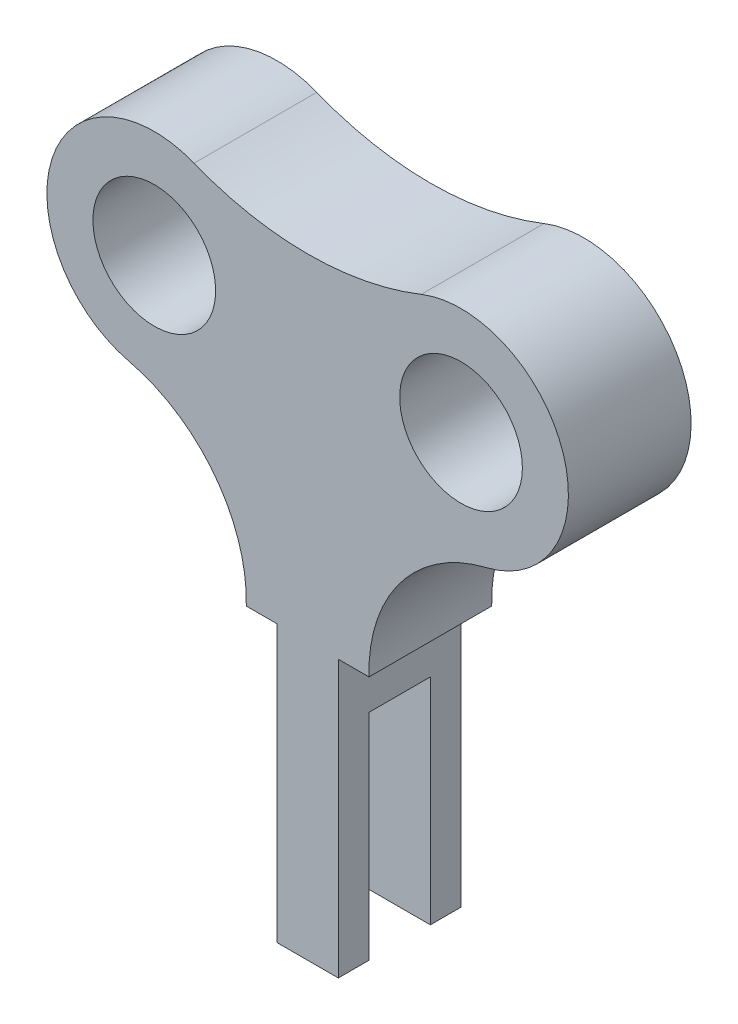
ISO-10303-21;
HEADER;
FILE_DESCRIPTION(('STEP AP214'),'2;1');
FILE_NAME('part.step','',(''),(''),'','','');
FILE_SCHEMA(('AUTOMOTIVE_DESIGN { 1 0 10303 214 1 1 1 1 }'));
ENDSEC;
DATA;
#1=APPLICATION_CONTEXT('core data for automotive mechanical design processes');
#2=APPLICATION_PROTOCOL_DEFINITION('international standard','automotive_design',2000,#1);
#3=PRODUCT_CONTEXT('',#1,'mechanical');
#4=PRODUCT('Part','Part','',(#3));
#5=PRODUCT_RELATED_PRODUCT_CATEGORY('part','',(#4));
#6=PRODUCT_DEFINITION_FORMATION('','',#4);
#7=PRODUCT_DEFINITION_CONTEXT('part definition',#1,'design');
#8=PRODUCT_DEFINITION('design','',#6,#7);
#9=PRODUCT_DEFINITION_SHAPE('','',#8);
#10=(LENGTH_UNIT() NAMED_UNIT(*) SI_UNIT(.MILLI.,.METRE.));
#11=(NAMED_UNIT(*) PLANE_ANGLE_UNIT() SI_UNIT($,.RADIAN.));
#12=(NAMED_UNIT(*) SI_UNIT($,.STERADIAN.) SOLID_ANGLE_UNIT());
#13=UNCERTAINTY_MEASURE_WITH_UNIT(LENGTH_MEASURE(1.E-05),#10,'distance_accuracy_value','');
#14=(GEOMETRIC_REPRESENTATION_CONTEXT(3) GLOBAL_UNCERTAINTY_ASSIGNED_CONTEXT((#13)) GLOBAL_UNIT_ASSIGNED_CONTEXT((#10,
#11,#12)) REPRESENTATION_CONTEXT('',''));
#15=CARTESIAN_POINT('',(0.,0.,0.));
#16=DIRECTION('',(0.,0.,1.));
#17=DIRECTION('',(1.,0.,0.));
#18=AXIS2_PLACEMENT_3D('',#15,#16,#17);
#19=CARTESIAN_POINT('',(-5.,-22.5,10.));
#20=DIRECTION('',(0.,1.,0.));
#21=DIRECTION('',(0.,0.,1.));
#22=AXIS2_PLACEMENT_3D('',#19,#20,#21);
#23=PLANE('',#22);
#24=DIRECTION('',(0.,0.,-1.));
#25=VECTOR('',#24,1.);
#26=CARTESIAN_POINT('',(5.,-22.5,10.));
#27=LINE('',#26,#25);
#28=CARTESIAN_POINT('',(5.,-22.5,-5.));
#29=VERTEX_POINT('',#28);
#30=CARTESIAN_POINT('',(5.,-22.5,-10.));
#31=VERTEX_POINT('',#30);
#32=EDGE_CURVE('E101',#29,#31,#27,.T.);
#33=ORIENTED_EDGE('',*,*,#32,.F.);
#34=DIRECTION('',(-1.,0.,0.));
#35=VECTOR('',#34,1.);
#36=CARTESIAN_POINT('',(41.4005494464026,-22.5,-5.));
#37=LINE('',#36,#35);
#38=CARTESIAN_POINT('',(-5.,-22.5,-5.));
#39=VERTEX_POINT('',#38);
#40=EDGE_CURVE('E246',#29,#39,#37,.T.);
#41=ORIENTED_EDGE('',*,*,#40,.T.);
#42=DIRECTION('',(0.,0.,-1.));
#43=VECTOR('',#42,1.);
#44=CARTESIAN_POINT('',(-5.,-22.5,10.));
#45=LINE('',#44,#43);
#46=CARTESIAN_POINT('',(-5.,-22.5,-10.));
#47=VERTEX_POINT('',#46);
#48=EDGE_CURVE('E187',#39,#47,#45,.T.);
#49=ORIENTED_EDGE('',*,*,#48,.T.);
#50=DIRECTION('',(1.,0.,0.));
#51=VECTOR('',#50,1.);
#52=CARTESIAN_POINT('',(-5.,-22.5,-10.));
#53=LINE('',#52,#51);
#54=EDGE_CURVE('E181',#47,#31,#53,.T.);
#55=ORIENTED_EDGE('',*,*,#54,.T.);
#56=EDGE_LOOP('',(#33,#41,#49,#55));
#57=FACE_BOUND('',#56,.T.);
#58=ADVANCED_FACE('F37',(#57),#23,.F.);
#59=CARTESIAN_POINT('',(-34.990451034251,23.1909103449104,10.));
#60=DIRECTION('',(0.,0.,1.));
#61=DIRECTION('',(1.,0.,0.));
#62=AXIS2_PLACEMENT_3D('',#59,#60,#61);
#63=PLANE('',#62);
#64=CARTESIAN_POINT('',(25.,64.5,10.));
#65=DIRECTION('',(0.,0.,1.));
#66=DIRECTION('',(1.,0.,0.));
#67=AXIS2_PLACEMENT_3D('',#64,#65,#66);
#68=CIRCLE('',#67,10.);
#69=CARTESIAN_POINT('',(35.,64.5,10.));
#70=VERTEX_POINT('',#69);
#71=EDGE_CURVE('E166',#70,#70,#68,.T.);
#72=ORIENTED_EDGE('',*,*,#71,.F.);
#73=EDGE_LOOP('',(#72));
#74=FACE_BOUND('',#73,.T.);
#75=DIRECTION('',(0.,1.,0.));
#76=VECTOR('',#75,1.);
#77=CARTESIAN_POINT('',(5.,22.5,10.));
#78=LINE('',#77,#76);
#79=CARTESIAN_POINT('',(5.,-22.5,10.));
#80=VERTEX_POINT('',#79);
#81=CARTESIAN_POINT('',(5.,22.5,10.));
#82=VERTEX_POINT('',#81);
#83=EDGE_CURVE('E183',#80,#82,#78,.T.);
#84=ORIENTED_EDGE('',*,*,#83,.T.);
#85=DIRECTION('',(1.,0.,0.));
#86=VECTOR('',#85,1.);
#87=CARTESIAN_POINT('',(5.,22.5,10.));
#88=LINE('',#87,#86);
#89=CARTESIAN_POINT('',(10.,22.5,10.));
#90=VERTEX_POINT('',#89);
#91=EDGE_CURVE('E109',#82,#90,#88,.T.);
#92=ORIENTED_EDGE('',*,*,#91,.T.);
#93=CARTESIAN_POINT('',(34.990451034251,23.1909103449104,10.));
#94=DIRECTION('',(0.,0.,-1.));
#95=DIRECTION('',(-1.,0.,0.));
#96=AXIS2_PLACEMENT_3D('',#93,#94,#95);
#97=CIRCLE('',#96,25.);
#98=CARTESIAN_POINT('',(29.1137151317504,47.4903748479043,10.));
#99=VERTEX_POINT('',#98);
#100=EDGE_CURVE('E207',#90,#99,#97,.T.);
#101=ORIENTED_EDGE('',*,*,#100,.T.);
#102=CARTESIAN_POINT('',(25.,64.5,10.));
#103=DIRECTION('',(0.,0.,1.));
#104=DIRECTION('',(-1.,0.,0.));
#105=AXIS2_PLACEMENT_3D('',#102,#103,#104);
#106=CIRCLE('',#105,17.5);
#107=CARTESIAN_POINT('',(18.5185185185185,80.7554728570169,10.));
#108=VERTEX_POINT('',#107);
#109=EDGE_CURVE('E226',#99,#108,#106,.T.);
#110=ORIENTED_EDGE('',*,*,#109,.T.);
#111=CARTESIAN_POINT('',(0.,127.199681019922,10.));
#112=DIRECTION('',(0.,0.,-1.));
#113=DIRECTION('',(1.,0.,0.));
#114=AXIS2_PLACEMENT_3D('',#111,#112,#113);
#115=CIRCLE('',#114,50.);
#116=CARTESIAN_POINT('',(-18.5185185185185,80.7554728570169,10.));
#117=VERTEX_POINT('',#116);
#118=EDGE_CURVE('E223',#108,#117,#115,.T.);
#119=ORIENTED_EDGE('',*,*,#118,.T.);
#120=CARTESIAN_POINT('',(-25.,64.5,10.));
#121=DIRECTION('',(0.,0.,1.));
#122=DIRECTION('',(1.,0.,0.));
#123=AXIS2_PLACEMENT_3D('',#120,#121,#122);
#124=CIRCLE('',#123,17.5);
#125=CARTESIAN_POINT('',(-29.1137151317504,47.4903748479043,10.));
#126=VERTEX_POINT('',#125);
#127=EDGE_CURVE('E225',#117,#126,#124,.T.);
#128=ORIENTED_EDGE('',*,*,#127,.T.);
#129=CARTESIAN_POINT('',(-34.990451034251,23.1909103449104,10.));
#130=DIRECTION('',(0.,0.,-1.));
#131=DIRECTION('',(1.,0.,0.));
#132=AXIS2_PLACEMENT_3D('',#129,#130,#131);
#133=CIRCLE('',#132,25.);
#134=CARTESIAN_POINT('',(-10.,22.5,10.));
#135=VERTEX_POINT('',#134);
#136=EDGE_CURVE('E139',#126,#135,#133,.T.);
#137=ORIENTED_EDGE('',*,*,#136,.T.);
#138=DIRECTION('',(1.,0.,0.));
#139=VECTOR('',#138,1.);
#140=CARTESIAN_POINT('',(-5.,22.5,10.));
#141=LINE('',#140,#139);
#142=CARTESIAN_POINT('',(-5.,22.5,10.));
#143=VERTEX_POINT('',#142);
#144=EDGE_CURVE('E131',#135,#143,#141,.T.);
#145=ORIENTED_EDGE('',*,*,#144,.T.);
#146=DIRECTION('',(0.,-1.,0.));
#147=VECTOR('',#146,1.);
#148=CARTESIAN_POINT('',(-5.,22.5,10.));
#149=LINE('',#148,#147);
#150=CARTESIAN_POINT('',(-5.,-22.5,10.));
#151=VERTEX_POINT('',#150);
#152=EDGE_CURVE('E136',#143,#151,#149,.T.);
#153=ORIENTED_EDGE('',*,*,#152,.T.);
#154=DIRECTION('',(1.,0.,0.));
#155=VECTOR('',#154,1.);
#156=CARTESIAN_POINT('',(-5.,-22.5,10.));
#157=LINE('',#156,#155);
#158=EDGE_CURVE('E61',#151,#80,#157,.T.);
#159=ORIENTED_EDGE('',*,*,#158,.T.);
#160=EDGE_LOOP('',(#84,#92,#101,#110,#119,#128,#137,#145,#153,#159));
#161=FACE_BOUND('',#160,.T.);
#162=CARTESIAN_POINT('',(-25.,64.5,10.));
#163=DIRECTION('',(0.,0.,1.));
#164=DIRECTION('',(-1.,0.,0.));
#165=AXIS2_PLACEMENT_3D('',#162,#163,#164);
#166=CIRCLE('',#165,9.99999999999999);
#167=CARTESIAN_POINT('',(-35.,64.5,10.));
#168=VERTEX_POINT('',#167);
#169=EDGE_CURVE('E237',#168,#168,#166,.T.);
#170=ORIENTED_EDGE('',*,*,#169,.F.);
#171=EDGE_LOOP('',(#170));
#172=FACE_BOUND('',#171,.T.);
#173=ADVANCED_FACE('F133',(#74,#161,#172),#63,.T.);
#174=CARTESIAN_POINT('',(-34.990451034251,23.1909103449104,-10.));
#175=DIRECTION('',(0.,0.,1.));
#176=DIRECTION('',(1.,0.,0.));
#177=AXIS2_PLACEMENT_3D('',#174,#175,#176);
#178=PLANE('',#177);
#179=DIRECTION('',(0.,1.,0.));
#180=VECTOR('',#179,1.);
#181=CARTESIAN_POINT('',(5.,22.5,-10.));
#182=LINE('',#181,#180);
#183=CARTESIAN_POINT('',(5.,22.5,-10.));
#184=VERTEX_POINT('',#183);
#185=EDGE_CURVE('E163',#31,#184,#182,.T.);
#186=ORIENTED_EDGE('',*,*,#185,.F.);
#187=ORIENTED_EDGE('',*,*,#54,.F.);
#188=DIRECTION('',(0.,-1.,0.));
#189=VECTOR('',#188,1.);
#190=CARTESIAN_POINT('',(-5.,22.5,-10.));
#191=LINE('',#190,#189);
#192=CARTESIAN_POINT('',(-5.,22.5,-10.));
#193=VERTEX_POINT('',#192);
#194=EDGE_CURVE('E179',#193,#47,#191,.T.);
#195=ORIENTED_EDGE('',*,*,#194,.F.);
#196=DIRECTION('',(1.,0.,0.));
#197=VECTOR('',#196,1.);
#198=CARTESIAN_POINT('',(-5.,22.5,-10.));
#199=LINE('',#198,#197);
#200=CARTESIAN_POINT('',(-10.,22.5,-10.));
#201=VERTEX_POINT('',#200);
#202=EDGE_CURVE('E148',#201,#193,#199,.T.);
#203=ORIENTED_EDGE('',*,*,#202,.F.);
#204=CARTESIAN_POINT('',(-34.990451034251,23.1909103449104,-10.));
#205=DIRECTION('',(0.,0.,-1.));
#206=DIRECTION('',(1.,0.,0.));
#207=AXIS2_PLACEMENT_3D('',#204,#205,#206);
#208=CIRCLE('',#207,25.);
#209=CARTESIAN_POINT('',(-29.1137151317504,47.4903748479043,-10.));
#210=VERTEX_POINT('',#209);
#211=EDGE_CURVE('E176',#210,#201,#208,.T.);
#212=ORIENTED_EDGE('',*,*,#211,.F.);
#213=CARTESIAN_POINT('',(-25.,64.5,-10.));
#214=DIRECTION('',(0.,0.,1.));
#215=DIRECTION('',(1.,0.,0.));
#216=AXIS2_PLACEMENT_3D('',#213,#214,#215);
#217=CIRCLE('',#216,17.5);
#218=CARTESIAN_POINT('',(-18.5185185185185,80.7554728570169,-10.));
#219=VERTEX_POINT('',#218);
#220=EDGE_CURVE('E174',#219,#210,#217,.T.);
#221=ORIENTED_EDGE('',*,*,#220,.F.);
#222=CARTESIAN_POINT('',(0.,127.199681019922,-10.));
#223=DIRECTION('',(0.,0.,-1.));
#224=DIRECTION('',(1.,0.,0.));
#225=AXIS2_PLACEMENT_3D('',#222,#223,#224);
#226=CIRCLE('',#225,50.);
#227=CARTESIAN_POINT('',(18.5185185185185,80.7554728570169,-10.));
#228=VERTEX_POINT('',#227);
#229=EDGE_CURVE('E172',#228,#219,#226,.T.);
#230=ORIENTED_EDGE('',*,*,#229,.F.);
#231=CARTESIAN_POINT('',(25.,64.5,-10.));
#232=DIRECTION('',(0.,0.,1.));
#233=DIRECTION('',(-1.,0.,0.));
#234=AXIS2_PLACEMENT_3D('',#231,#232,#233);
#235=CIRCLE('',#234,17.5);
#236=CARTESIAN_POINT('',(29.1137151317504,47.4903748479043,-10.));
#237=VERTEX_POINT('',#236);
#238=EDGE_CURVE('E170',#237,#228,#235,.T.);
#239=ORIENTED_EDGE('',*,*,#238,.F.);
#240=CARTESIAN_POINT('',(34.990451034251,23.1909103449104,-10.));
#241=DIRECTION('',(0.,0.,-1.));
#242=DIRECTION('',(-1.,0.,0.));
#243=AXIS2_PLACEMENT_3D('',#240,#241,#242);
#244=CIRCLE('',#243,25.);
#245=CARTESIAN_POINT('',(10.,22.5,-10.));
#246=VERTEX_POINT('',#245);
#247=EDGE_CURVE('E168',#246,#237,#244,.T.);
#248=ORIENTED_EDGE('',*,*,#247,.F.);
#249=DIRECTION('',(1.,0.,0.));
#250=VECTOR('',#249,1.);
#251=CARTESIAN_POINT('',(5.,22.5,-10.));
#252=LINE('',#251,#250);
#253=EDGE_CURVE('E165',#184,#246,#252,.T.);
#254=ORIENTED_EDGE('',*,*,#253,.F.);
#255=EDGE_LOOP('',(#186,#187,#195,#203,#212,#221,#230,#239,#248,#254));
#256=FACE_BOUND('',#255,.T.);
#257=CARTESIAN_POINT('',(25.,64.5,-10.));
#258=DIRECTION('',(0.,0.,1.));
#259=DIRECTION('',(1.,0.,0.));
#260=AXIS2_PLACEMENT_3D('',#257,#258,#259);
#261=CIRCLE('',#260,10.);
#262=CARTESIAN_POINT('',(35.,64.5,-10.));
#263=VERTEX_POINT('',#262);
#264=EDGE_CURVE('E234',#263,#263,#261,.T.);
#265=ORIENTED_EDGE('',*,*,#264,.T.);
#266=EDGE_LOOP('',(#265));
#267=FACE_BOUND('',#266,.T.);
#268=CARTESIAN_POINT('',(-25.,64.5,-10.));
#269=DIRECTION('',(0.,0.,1.));
#270=DIRECTION('',(-1.,0.,0.));
#271=AXIS2_PLACEMENT_3D('',#268,#269,#270);
#272=CIRCLE('',#271,9.99999999999999);
#273=CARTESIAN_POINT('',(-35.,64.5,-10.));
#274=VERTEX_POINT('',#273);
#275=EDGE_CURVE('E240',#274,#274,#272,.T.);
#276=ORIENTED_EDGE('',*,*,#275,.T.);
#277=EDGE_LOOP('',(#276));
#278=FACE_BOUND('',#277,.T.);
#279=ADVANCED_FACE('F211',(#256,#267,#278),#178,.F.);
#280=CARTESIAN_POINT('',(5.,22.5,10.));
#281=DIRECTION('',(-1.,0.,0.));
#282=DIRECTION('',(0.,-1.,0.));
#283=AXIS2_PLACEMENT_3D('',#280,#281,#282);
#284=PLANE('',#283);
#285=DIRECTION('',(0.,0.,1.));
#286=VECTOR('',#285,1.);
#287=CARTESIAN_POINT('',(5.,12.5,-5.));
#288=LINE('',#287,#286);
#289=CARTESIAN_POINT('',(5.,12.5,-5.));
#290=VERTEX_POINT('',#289);
#291=CARTESIAN_POINT('',(5.,12.5,5.));
#292=VERTEX_POINT('',#291);
#293=EDGE_CURVE('E268',#290,#292,#288,.T.);
#294=ORIENTED_EDGE('',*,*,#293,.F.);
#295=DIRECTION('',(0.,1.,0.));
#296=VECTOR('',#295,1.);
#297=CARTESIAN_POINT('',(5.,-22.5,-5.));
#298=LINE('',#297,#296);
#299=EDGE_CURVE('E243',#29,#290,#298,.T.);
#300=ORIENTED_EDGE('',*,*,#299,.F.);
#301=ORIENTED_EDGE('',*,*,#32,.T.);
#302=ORIENTED_EDGE('',*,*,#185,.T.);
#303=DIRECTION('',(0.,0.,-1.));
#304=VECTOR('',#303,1.);
#305=CARTESIAN_POINT('',(5.,22.5,10.));
#306=LINE('',#305,#304);
#307=EDGE_CURVE('E11',#82,#184,#306,.T.);
#308=ORIENTED_EDGE('',*,*,#307,.F.);
#309=ORIENTED_EDGE('',*,*,#83,.F.);
#310=CARTESIAN_POINT('',(5.,-22.5,5.));
#311=VERTEX_POINT('',#310);
#312=EDGE_CURVE('E184',#80,#311,#27,.T.);
#313=ORIENTED_EDGE('',*,*,#312,.T.);
#314=DIRECTION('',(0.,-1.,0.));
#315=VECTOR('',#314,1.);
#316=CARTESIAN_POINT('',(5.,-22.5,5.));
#317=LINE('',#316,#315);
#318=EDGE_CURVE('E52',#292,#311,#317,.T.);
#319=ORIENTED_EDGE('',*,*,#318,.F.);
#320=EDGE_LOOP('',(#294,#300,#301,#302,#308,#309,#313,#319));
#321=FACE_BOUND('',#320,.T.);
#322=ADVANCED_FACE('F39',(#321),#284,.F.);
#323=CARTESIAN_POINT('',(5.,22.5,10.));
#324=DIRECTION('',(0.,1.,0.));
#325=DIRECTION('',(0.,0.,1.));
#326=AXIS2_PLACEMENT_3D('',#323,#324,#325);
#327=PLANE('',#326);
#328=ORIENTED_EDGE('',*,*,#253,.T.);
#329=DIRECTION('',(0.,0.,-1.));
#330=VECTOR('',#329,1.);
#331=CARTESIAN_POINT('',(10.,22.5,10.));
#332=LINE('',#331,#330);
#333=EDGE_CURVE('E45',#90,#246,#332,.T.);
#334=ORIENTED_EDGE('',*,*,#333,.F.);
#335=ORIENTED_EDGE('',*,*,#91,.F.);
#336=ORIENTED_EDGE('',*,*,#307,.T.);
#337=EDGE_LOOP('',(#328,#334,#335,#336));
#338=FACE_BOUND('',#337,.T.);
#339=ADVANCED_FACE('F297',(#338),#327,.F.);
#340=CARTESIAN_POINT('',(34.990451034251,23.1909103449104,10.));
#341=DIRECTION('',(0.,0.,-1.));
#342=DIRECTION('',(-1.,0.,0.));
#343=AXIS2_PLACEMENT_3D('',#340,#341,#342);
#344=CYLINDRICAL_SURFACE('',#343,25.);
#345=ORIENTED_EDGE('',*,*,#247,.T.);
#346=DIRECTION('',(0.,0.,-1.));
#347=VECTOR('',#346,1.);
#348=CARTESIAN_POINT('',(29.1137151317504,47.4903748479043,10.));
#349=LINE('',#348,#347);
#350=EDGE_CURVE('E199',#99,#237,#349,.T.);
#351=ORIENTED_EDGE('',*,*,#350,.F.);
#352=ORIENTED_EDGE('',*,*,#100,.F.);
#353=ORIENTED_EDGE('',*,*,#333,.T.);
#354=EDGE_LOOP('',(#345,#351,#352,#353));
#355=FACE_BOUND('',#354,.T.);
#356=ADVANCED_FACE('F205',(#355),#344,.F.);
#357=CARTESIAN_POINT('',(25.,64.5,10.));
#358=DIRECTION('',(0.,0.,-1.));
#359=DIRECTION('',(-1.,0.,0.));
#360=AXIS2_PLACEMENT_3D('',#357,#358,#359);
#361=CYLINDRICAL_SURFACE('',#360,17.5);
#362=ORIENTED_EDGE('',*,*,#238,.T.);
#363=DIRECTION('',(0.,0.,-1.));
#364=VECTOR('',#363,1.);
#365=CARTESIAN_POINT('',(18.5185185185185,80.7554728570169,10.));
#366=LINE('',#365,#364);
#367=EDGE_CURVE('E196',#108,#228,#366,.T.);
#368=ORIENTED_EDGE('',*,*,#367,.F.);
#369=ORIENTED_EDGE('',*,*,#109,.F.);
#370=ORIENTED_EDGE('',*,*,#350,.T.);
#371=EDGE_LOOP('',(#362,#368,#369,#370));
#372=FACE_BOUND('',#371,.T.);
#373=ADVANCED_FACE('F217',(#372),#361,.T.);
#374=CARTESIAN_POINT('',(0.,127.199681019922,10.));
#375=DIRECTION('',(0.,0.,-1.));
#376=DIRECTION('',(-1.,0.,0.));
#377=AXIS2_PLACEMENT_3D('',#374,#375,#376);
#378=CYLINDRICAL_SURFACE('',#377,50.);
#379=ORIENTED_EDGE('',*,*,#229,.T.);
#380=DIRECTION('',(0.,0.,-1.));
#381=VECTOR('',#380,1.);
#382=CARTESIAN_POINT('',(-18.5185185185185,80.7554728570169,10.));
#383=LINE('',#382,#381);
#384=EDGE_CURVE('E193',#117,#219,#383,.T.);
#385=ORIENTED_EDGE('',*,*,#384,.F.);
#386=ORIENTED_EDGE('',*,*,#118,.F.);
#387=ORIENTED_EDGE('',*,*,#367,.T.);
#388=EDGE_LOOP('',(#379,#385,#386,#387));
#389=FACE_BOUND('',#388,.T.);
#390=ADVANCED_FACE('F221',(#389),#378,.F.);
#391=CARTESIAN_POINT('',(-25.,64.5,10.));
#392=DIRECTION('',(0.,0.,-1.));
#393=DIRECTION('',(-1.,0.,0.));
#394=AXIS2_PLACEMENT_3D('',#391,#392,#393);
#395=CYLINDRICAL_SURFACE('',#394,17.5);
#396=ORIENTED_EDGE('',*,*,#220,.T.);
#397=DIRECTION('',(0.,0.,-1.));
#398=VECTOR('',#397,1.);
#399=CARTESIAN_POINT('',(-29.1137151317504,47.4903748479043,10.));
#400=LINE('',#399,#398);
#401=EDGE_CURVE('E190',#126,#210,#400,.T.);
#402=ORIENTED_EDGE('',*,*,#401,.F.);
#403=ORIENTED_EDGE('',*,*,#127,.F.);
#404=ORIENTED_EDGE('',*,*,#384,.T.);
#405=EDGE_LOOP('',(#396,#402,#403,#404));
#406=FACE_BOUND('',#405,.T.);
#407=ADVANCED_FACE('F330',(#406),#395,.T.);
#408=CARTESIAN_POINT('',(-34.990451034251,23.1909103449104,10.));
#409=DIRECTION('',(0.,0.,-1.));
#410=DIRECTION('',(-1.,0.,0.));
#411=AXIS2_PLACEMENT_3D('',#408,#409,#410);
#412=CYLINDRICAL_SURFACE('',#411,25.);
#413=ORIENTED_EDGE('',*,*,#211,.T.);
#414=DIRECTION('',(0.,0.,-1.));
#415=VECTOR('',#414,1.);
#416=CARTESIAN_POINT('',(-10.,22.5,10.));
#417=LINE('',#416,#415);
#418=EDGE_CURVE('E152',#135,#201,#417,.T.);
#419=ORIENTED_EDGE('',*,*,#418,.F.);
#420=ORIENTED_EDGE('',*,*,#136,.F.);
#421=ORIENTED_EDGE('',*,*,#401,.T.);
#422=EDGE_LOOP('',(#413,#419,#420,#421));
#423=FACE_BOUND('',#422,.T.);
#424=ADVANCED_FACE('F325',(#423),#412,.F.);
#425=CARTESIAN_POINT('',(-5.,22.5,10.));
#426=DIRECTION('',(0.,1.,0.));
#427=DIRECTION('',(0.,0.,1.));
#428=AXIS2_PLACEMENT_3D('',#425,#426,#427);
#429=PLANE('',#428);
#430=ORIENTED_EDGE('',*,*,#202,.T.);
#431=DIRECTION('',(0.,0.,-1.));
#432=VECTOR('',#431,1.);
#433=CARTESIAN_POINT('',(-5.,22.5,10.));
#434=LINE('',#433,#432);
#435=EDGE_CURVE('E145',#143,#193,#434,.T.);
#436=ORIENTED_EDGE('',*,*,#435,.F.);
#437=ORIENTED_EDGE('',*,*,#144,.F.);
#438=ORIENTED_EDGE('',*,*,#418,.T.);
#439=EDGE_LOOP('',(#430,#436,#437,#438));
#440=FACE_BOUND('',#439,.T.);
#441=ADVANCED_FACE('F146',(#440),#429,.F.);
#442=CARTESIAN_POINT('',(-5.,22.5,10.));
#443=DIRECTION('',(1.,0.,0.));
#444=DIRECTION('',(0.,1.,0.));
#445=AXIS2_PLACEMENT_3D('',#442,#443,#444);
#446=PLANE('',#445);
#447=ORIENTED_EDGE('',*,*,#48,.F.);
#448=DIRECTION('',(0.,-1.,0.));
#449=VECTOR('',#448,1.);
#450=CARTESIAN_POINT('',(-5.,-22.5,-5.));
#451=LINE('',#450,#449);
#452=CARTESIAN_POINT('',(-5.,12.5,-5.));
#453=VERTEX_POINT('',#452);
#454=EDGE_CURVE('E263',#453,#39,#451,.T.);
#455=ORIENTED_EDGE('',*,*,#454,.F.);
#456=DIRECTION('',(0.,0.,-1.));
#457=VECTOR('',#456,1.);
#458=CARTESIAN_POINT('',(-5.,12.5,-5.));
#459=LINE('',#458,#457);
#460=CARTESIAN_POINT('',(-5.,12.5,5.));
#461=VERTEX_POINT('',#460);
#462=EDGE_CURVE('E250',#461,#453,#459,.T.);
#463=ORIENTED_EDGE('',*,*,#462,.F.);
#464=DIRECTION('',(0.,1.,0.));
#465=VECTOR('',#464,1.);
#466=CARTESIAN_POINT('',(-5.,-22.5,5.));
#467=LINE('',#466,#465);
#468=CARTESIAN_POINT('',(-5.,-22.5,5.));
#469=VERTEX_POINT('',#468);
#470=EDGE_CURVE('E260',#469,#461,#467,.T.);
#471=ORIENTED_EDGE('',*,*,#470,.F.);
#472=EDGE_CURVE('E153',#151,#469,#45,.T.);
#473=ORIENTED_EDGE('',*,*,#472,.F.);
#474=ORIENTED_EDGE('',*,*,#152,.F.);
#475=ORIENTED_EDGE('',*,*,#435,.T.);
#476=ORIENTED_EDGE('',*,*,#194,.T.);
#477=EDGE_LOOP('',(#447,#455,#463,#471,#473,#474,#475,#476));
#478=FACE_BOUND('',#477,.T.);
#479=ADVANCED_FACE('F156',(#478),#446,.F.);
#480=ORIENTED_EDGE('',*,*,#472,.T.);
#481=DIRECTION('',(-1.,0.,0.));
#482=VECTOR('',#481,1.);
#483=CARTESIAN_POINT('',(41.4005494464026,-22.5,5.));
#484=LINE('',#483,#482);
#485=EDGE_CURVE('E249',#311,#469,#484,.T.);
#486=ORIENTED_EDGE('',*,*,#485,.F.);
#487=ORIENTED_EDGE('',*,*,#312,.F.);
#488=ORIENTED_EDGE('',*,*,#158,.F.);
#489=EDGE_LOOP('',(#480,#486,#487,#488));
#490=FACE_BOUND('',#489,.T.);
#491=ADVANCED_FACE('F281',(#490),#23,.F.);
#492=CARTESIAN_POINT('',(25.,64.5,10.));
#493=DIRECTION('',(0.,0.,-1.));
#494=DIRECTION('',(-1.,0.,0.));
#495=AXIS2_PLACEMENT_3D('',#492,#493,#494);
#496=CYLINDRICAL_SURFACE('',#495,10.);
#497=ORIENTED_EDGE('',*,*,#71,.T.);
#498=EDGE_LOOP('',(#497));
#499=FACE_BOUND('',#498,.T.);
#500=ORIENTED_EDGE('',*,*,#264,.F.);
#501=EDGE_LOOP('',(#500));
#502=FACE_BOUND('',#501,.T.);
#503=ADVANCED_FACE('F314',(#499,#502),#496,.F.);
#504=CARTESIAN_POINT('',(-25.,64.5,10.));
#505=DIRECTION('',(0.,0.,-1.));
#506=DIRECTION('',(-1.,0.,0.));
#507=AXIS2_PLACEMENT_3D('',#504,#505,#506);
#508=CYLINDRICAL_SURFACE('',#507,9.99999999999999);
#509=ORIENTED_EDGE('',*,*,#169,.T.);
#510=EDGE_LOOP('',(#509));
#511=FACE_BOUND('',#510,.T.);
#512=ORIENTED_EDGE('',*,*,#275,.F.);
#513=EDGE_LOOP('',(#512));
#514=FACE_BOUND('',#513,.T.);
#515=ADVANCED_FACE('F319',(#511,#514),#508,.F.);
#516=CARTESIAN_POINT('',(41.4005494464026,-22.5,-5.));
#517=DIRECTION('',(0.,0.,-1.));
#518=DIRECTION('',(0.,1.,0.));
#519=AXIS2_PLACEMENT_3D('',#516,#517,#518);
#520=PLANE('',#519);
#521=ORIENTED_EDGE('',*,*,#299,.T.);
#522=DIRECTION('',(-1.,0.,0.));
#523=VECTOR('',#522,1.);
#524=CARTESIAN_POINT('',(41.4005494464026,12.5,-5.));
#525=LINE('',#524,#523);
#526=EDGE_CURVE('E255',#290,#453,#525,.T.);
#527=ORIENTED_EDGE('',*,*,#526,.T.);
#528=ORIENTED_EDGE('',*,*,#454,.T.);
#529=ORIENTED_EDGE('',*,*,#40,.F.);
#530=EDGE_LOOP('',(#521,#527,#528,#529));
#531=FACE_BOUND('',#530,.T.);
#532=ADVANCED_FACE('F294',(#531),#520,.F.);
#533=CARTESIAN_POINT('',(41.4005494464026,12.5,-5.));
#534=DIRECTION('',(0.,1.,0.));
#535=DIRECTION('',(-1.,0.,0.));
#536=AXIS2_PLACEMENT_3D('',#533,#534,#535);
#537=PLANE('',#536);
#538=ORIENTED_EDGE('',*,*,#293,.T.);
#539=DIRECTION('',(-1.,0.,0.));
#540=VECTOR('',#539,1.);
#541=CARTESIAN_POINT('',(41.4005494464026,12.5,5.));
#542=LINE('',#541,#540);
#543=EDGE_CURVE('E252',#292,#461,#542,.T.);
#544=ORIENTED_EDGE('',*,*,#543,.T.);
#545=ORIENTED_EDGE('',*,*,#462,.T.);
#546=ORIENTED_EDGE('',*,*,#526,.F.);
#547=EDGE_LOOP('',(#538,#544,#545,#546));
#548=FACE_BOUND('',#547,.T.);
#549=ADVANCED_FACE('F274',(#548),#537,.F.);
#550=CARTESIAN_POINT('',(41.4005494464026,-22.5,5.));
#551=DIRECTION('',(0.,0.,1.));
#552=DIRECTION('',(1.,0.,0.));
#553=AXIS2_PLACEMENT_3D('',#550,#551,#552);
#554=PLANE('',#553);
#555=ORIENTED_EDGE('',*,*,#318,.T.);
#556=ORIENTED_EDGE('',*,*,#485,.T.);
#557=ORIENTED_EDGE('',*,*,#470,.T.);
#558=ORIENTED_EDGE('',*,*,#543,.F.);
#559=EDGE_LOOP('',(#555,#556,#557,#558));
#560=FACE_BOUND('',#559,.T.);
#561=ADVANCED_FACE('F276',(#560),#554,.F.);
#562=CLOSED_SHELL('',(#58,#173,#279,#322,#339,#356,#373,#390,#407,#424,#441,#479,#491,#503,#515,
#532,#549,#561));
#563=MANIFOLD_SOLID_BREP('B2',#562);
#564=ADVANCED_BREP_SHAPE_REPRESENTATION('',(#18,#563),#14);
#565=SHAPE_DEFINITION_REPRESENTATION(#9,#564);
ENDSEC;
END-ISO-10303-21;
